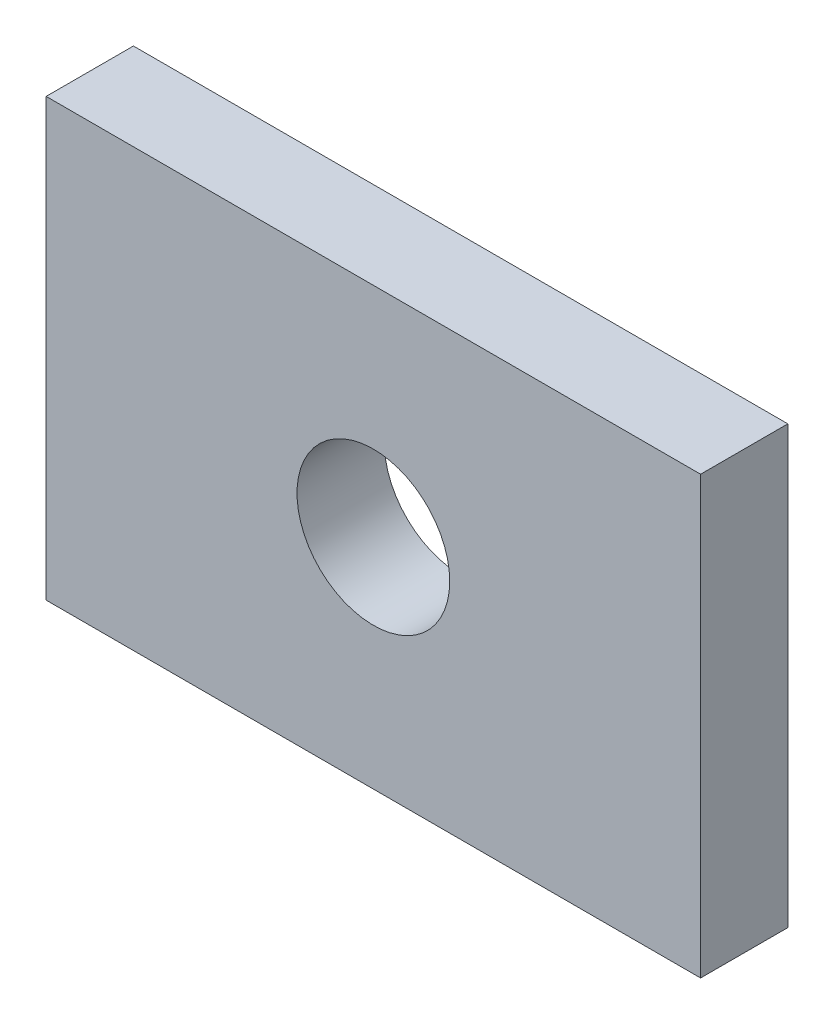
ISO-10303-21;
HEADER;
FILE_DESCRIPTION(('STEP AP214'),'2;1');
FILE_NAME('part.step','',(''),(''),'','','');
FILE_SCHEMA(('AUTOMOTIVE_DESIGN { 1 0 10303 214 1 1 1 1 }'));
ENDSEC;
DATA;
#1=APPLICATION_CONTEXT('core data for automotive mechanical design processes');
#2=APPLICATION_PROTOCOL_DEFINITION('international standard','automotive_design',2000,#1);
#3=PRODUCT_CONTEXT('',#1,'mechanical');
#4=PRODUCT('Part','Part','',(#3));
#5=PRODUCT_RELATED_PRODUCT_CATEGORY('part','',(#4));
#6=PRODUCT_DEFINITION_FORMATION('','',#4);
#7=PRODUCT_DEFINITION_CONTEXT('part definition',#1,'design');
#8=PRODUCT_DEFINITION('design','',#6,#7);
#9=PRODUCT_DEFINITION_SHAPE('','',#8);
#10=(LENGTH_UNIT() NAMED_UNIT(*) SI_UNIT(.MILLI.,.METRE.));
#11=(NAMED_UNIT(*) PLANE_ANGLE_UNIT() SI_UNIT($,.RADIAN.));
#12=(NAMED_UNIT(*) SI_UNIT($,.STERADIAN.) SOLID_ANGLE_UNIT());
#13=UNCERTAINTY_MEASURE_WITH_UNIT(LENGTH_MEASURE(1.E-05),#10,'distance_accuracy_value','');
#14=(GEOMETRIC_REPRESENTATION_CONTEXT(3) GLOBAL_UNCERTAINTY_ASSIGNED_CONTEXT((#13)) GLOBAL_UNIT_ASSIGNED_CONTEXT((#10,
#11,#12)) REPRESENTATION_CONTEXT('',''));
#15=CARTESIAN_POINT('',(0.,0.,0.));
#16=DIRECTION('',(0.,0.,1.));
#17=DIRECTION('',(1.,0.,0.));
#18=AXIS2_PLACEMENT_3D('',#15,#16,#17);
#19=CARTESIAN_POINT('',(0.,0.,2.));
#20=DIRECTION('',(0.,0.,1.));
#21=DIRECTION('',(1.,0.,0.));
#22=AXIS2_PLACEMENT_3D('',#19,#20,#21);
#23=PLANE('',#22);
#24=DIRECTION('',(0.,-1.,0.));
#25=VECTOR('',#24,1.);
#26=CARTESIAN_POINT('',(-7.5,5.,2.));
#27=LINE('',#26,#25);
#28=CARTESIAN_POINT('',(-7.5,5.,2.));
#29=VERTEX_POINT('',#28);
#30=CARTESIAN_POINT('',(-7.5,-5.,2.));
#31=VERTEX_POINT('',#30);
#32=EDGE_CURVE('E92',#29,#31,#27,.T.);
#33=ORIENTED_EDGE('',*,*,#32,.T.);
#34=DIRECTION('',(1.,0.,0.));
#35=VECTOR('',#34,1.);
#36=CARTESIAN_POINT('',(-7.5,-5.,2.));
#37=LINE('',#36,#35);
#38=CARTESIAN_POINT('',(7.5,-5.,2.));
#39=VERTEX_POINT('',#38);
#40=EDGE_CURVE('E87',#31,#39,#37,.T.);
#41=ORIENTED_EDGE('',*,*,#40,.T.);
#42=DIRECTION('',(0.,1.,0.));
#43=VECTOR('',#42,1.);
#44=CARTESIAN_POINT('',(7.5,5.,2.));
#45=LINE('',#44,#43);
#46=CARTESIAN_POINT('',(7.5,5.,2.));
#47=VERTEX_POINT('',#46);
#48=EDGE_CURVE('E90',#39,#47,#45,.T.);
#49=ORIENTED_EDGE('',*,*,#48,.T.);
#50=DIRECTION('',(-1.,0.,0.));
#51=VECTOR('',#50,1.);
#52=CARTESIAN_POINT('',(-7.5,5.,2.));
#53=LINE('',#52,#51);
#54=EDGE_CURVE('E57',#47,#29,#53,.T.);
#55=ORIENTED_EDGE('',*,*,#54,.T.);
#56=EDGE_LOOP('',(#33,#41,#49,#55));
#57=FACE_BOUND('',#56,.T.);
#58=CARTESIAN_POINT('',(0.,0.,2.));
#59=DIRECTION('',(0.,0.,1.));
#60=DIRECTION('',(1.,0.,0.));
#61=AXIS2_PLACEMENT_3D('',#58,#59,#60);
#62=CIRCLE('',#61,1.75);
#63=CARTESIAN_POINT('',(1.75,0.,2.));
#64=VERTEX_POINT('',#63);
#65=EDGE_CURVE('E112',#64,#64,#62,.T.);
#66=ORIENTED_EDGE('',*,*,#65,.F.);
#67=EDGE_LOOP('',(#66));
#68=FACE_BOUND('',#67,.T.);
#69=ADVANCED_FACE('F39',(#57,#68),#23,.T.);
#70=CARTESIAN_POINT('',(0.,0.,0.));
#71=DIRECTION('',(0.,0.,1.));
#72=DIRECTION('',(1.,0.,0.));
#73=AXIS2_PLACEMENT_3D('',#70,#71,#72);
#74=PLANE('',#73);
#75=DIRECTION('',(0.,-1.,0.));
#76=VECTOR('',#75,1.);
#77=CARTESIAN_POINT('',(-7.5,5.,0.));
#78=LINE('',#77,#76);
#79=CARTESIAN_POINT('',(-7.5,5.,0.));
#80=VERTEX_POINT('',#79);
#81=CARTESIAN_POINT('',(-7.5,-5.,0.));
#82=VERTEX_POINT('',#81);
#83=EDGE_CURVE('E108',#80,#82,#78,.T.);
#84=ORIENTED_EDGE('',*,*,#83,.F.);
#85=DIRECTION('',(-1.,0.,0.));
#86=VECTOR('',#85,1.);
#87=CARTESIAN_POINT('',(-7.5,5.,0.));
#88=LINE('',#87,#86);
#89=CARTESIAN_POINT('',(7.5,5.,0.));
#90=VERTEX_POINT('',#89);
#91=EDGE_CURVE('E80',#90,#80,#88,.T.);
#92=ORIENTED_EDGE('',*,*,#91,.F.);
#93=DIRECTION('',(0.,1.,0.));
#94=VECTOR('',#93,1.);
#95=CARTESIAN_POINT('',(7.5,5.,0.));
#96=LINE('',#95,#94);
#97=CARTESIAN_POINT('',(7.5,-5.,0.));
#98=VERTEX_POINT('',#97);
#99=EDGE_CURVE('E74',#98,#90,#96,.T.);
#100=ORIENTED_EDGE('',*,*,#99,.F.);
#101=DIRECTION('',(1.,0.,0.));
#102=VECTOR('',#101,1.);
#103=CARTESIAN_POINT('',(-7.5,-5.,0.));
#104=LINE('',#103,#102);
#105=EDGE_CURVE('E97',#82,#98,#104,.T.);
#106=ORIENTED_EDGE('',*,*,#105,.F.);
#107=EDGE_LOOP('',(#84,#92,#100,#106));
#108=FACE_BOUND('',#107,.T.);
#109=CARTESIAN_POINT('',(0.,0.,0.));
#110=DIRECTION('',(0.,0.,1.));
#111=DIRECTION('',(1.,0.,0.));
#112=AXIS2_PLACEMENT_3D('',#109,#110,#111);
#113=CIRCLE('',#112,1.75);
#114=CARTESIAN_POINT('',(1.75,0.,0.));
#115=VERTEX_POINT('',#114);
#116=EDGE_CURVE('E130',#115,#115,#113,.T.);
#117=ORIENTED_EDGE('',*,*,#116,.T.);
#118=EDGE_LOOP('',(#117));
#119=FACE_BOUND('',#118,.T.);
#120=ADVANCED_FACE('F125',(#108,#119),#74,.F.);
#121=CARTESIAN_POINT('',(-7.5,5.,2.));
#122=DIRECTION('',(1.,0.,0.));
#123=DIRECTION('',(0.,0.,-1.));
#124=AXIS2_PLACEMENT_3D('',#121,#122,#123);
#125=PLANE('',#124);
#126=ORIENTED_EDGE('',*,*,#83,.T.);
#127=DIRECTION('',(0.,0.,-1.));
#128=VECTOR('',#127,1.);
#129=CARTESIAN_POINT('',(-7.5,-5.,2.));
#130=LINE('',#129,#128);
#131=EDGE_CURVE('E11',#31,#82,#130,.T.);
#132=ORIENTED_EDGE('',*,*,#131,.F.);
#133=ORIENTED_EDGE('',*,*,#32,.F.);
#134=DIRECTION('',(0.,0.,-1.));
#135=VECTOR('',#134,1.);
#136=CARTESIAN_POINT('',(-7.5,5.,2.));
#137=LINE('',#136,#135);
#138=EDGE_CURVE('E104',#29,#80,#137,.T.);
#139=ORIENTED_EDGE('',*,*,#138,.T.);
#140=EDGE_LOOP('',(#126,#132,#133,#139));
#141=FACE_BOUND('',#140,.T.);
#142=ADVANCED_FACE('F41',(#141),#125,.F.);
#143=CARTESIAN_POINT('',(-7.5,-5.,2.));
#144=DIRECTION('',(0.,1.,0.));
#145=DIRECTION('',(-1.,0.,0.));
#146=AXIS2_PLACEMENT_3D('',#143,#144,#145);
#147=PLANE('',#146);
#148=ORIENTED_EDGE('',*,*,#105,.T.);
#149=DIRECTION('',(0.,0.,-1.));
#150=VECTOR('',#149,1.);
#151=CARTESIAN_POINT('',(7.5,-5.,2.));
#152=LINE('',#151,#150);
#153=EDGE_CURVE('E49',#39,#98,#152,.T.);
#154=ORIENTED_EDGE('',*,*,#153,.F.);
#155=ORIENTED_EDGE('',*,*,#40,.F.);
#156=ORIENTED_EDGE('',*,*,#131,.T.);
#157=EDGE_LOOP('',(#148,#154,#155,#156));
#158=FACE_BOUND('',#157,.T.);
#159=ADVANCED_FACE('F96',(#158),#147,.F.);
#160=CARTESIAN_POINT('',(7.5,5.,2.));
#161=DIRECTION('',(-1.,0.,0.));
#162=DIRECTION('',(0.,-1.,0.));
#163=AXIS2_PLACEMENT_3D('',#160,#161,#162);
#164=PLANE('',#163);
#165=ORIENTED_EDGE('',*,*,#99,.T.);
#166=DIRECTION('',(0.,0.,-1.));
#167=VECTOR('',#166,1.);
#168=CARTESIAN_POINT('',(7.5,5.,2.));
#169=LINE('',#168,#167);
#170=EDGE_CURVE('E99',#47,#90,#169,.T.);
#171=ORIENTED_EDGE('',*,*,#170,.F.);
#172=ORIENTED_EDGE('',*,*,#48,.F.);
#173=ORIENTED_EDGE('',*,*,#153,.T.);
#174=EDGE_LOOP('',(#165,#171,#172,#173));
#175=FACE_BOUND('',#174,.T.);
#176=ADVANCED_FACE('F100',(#175),#164,.F.);
#177=CARTESIAN_POINT('',(-7.5,5.,2.));
#178=DIRECTION('',(0.,-1.,0.));
#179=DIRECTION('',(0.,0.,-1.));
#180=AXIS2_PLACEMENT_3D('',#177,#178,#179);
#181=PLANE('',#180);
#182=ORIENTED_EDGE('',*,*,#91,.T.);
#183=ORIENTED_EDGE('',*,*,#138,.F.);
#184=ORIENTED_EDGE('',*,*,#54,.F.);
#185=ORIENTED_EDGE('',*,*,#170,.T.);
#186=EDGE_LOOP('',(#182,#183,#184,#185));
#187=FACE_BOUND('',#186,.T.);
#188=ADVANCED_FACE('F122',(#187),#181,.F.);
#189=CARTESIAN_POINT('',(0.,0.,2.));
#190=DIRECTION('',(0.,0.,-1.));
#191=DIRECTION('',(-1.,0.,0.));
#192=AXIS2_PLACEMENT_3D('',#189,#190,#191);
#193=CYLINDRICAL_SURFACE('',#192,1.75);
#194=ORIENTED_EDGE('',*,*,#65,.T.);
#195=EDGE_LOOP('',(#194));
#196=FACE_BOUND('',#195,.T.);
#197=ORIENTED_EDGE('',*,*,#116,.F.);
#198=EDGE_LOOP('',(#197));
#199=FACE_BOUND('',#198,.T.);
#200=ADVANCED_FACE('F138',(#196,#199),#193,.F.);
#201=CLOSED_SHELL('',(#69,#120,#142,#159,#176,#188,#200));
#202=MANIFOLD_SOLID_BREP('B2',#201);
#203=ADVANCED_BREP_SHAPE_REPRESENTATION('',(#18,#202),#14);
#204=SHAPE_DEFINITION_REPRESENTATION(#9,#203);
ENDSEC;
END-ISO-10303-21;
